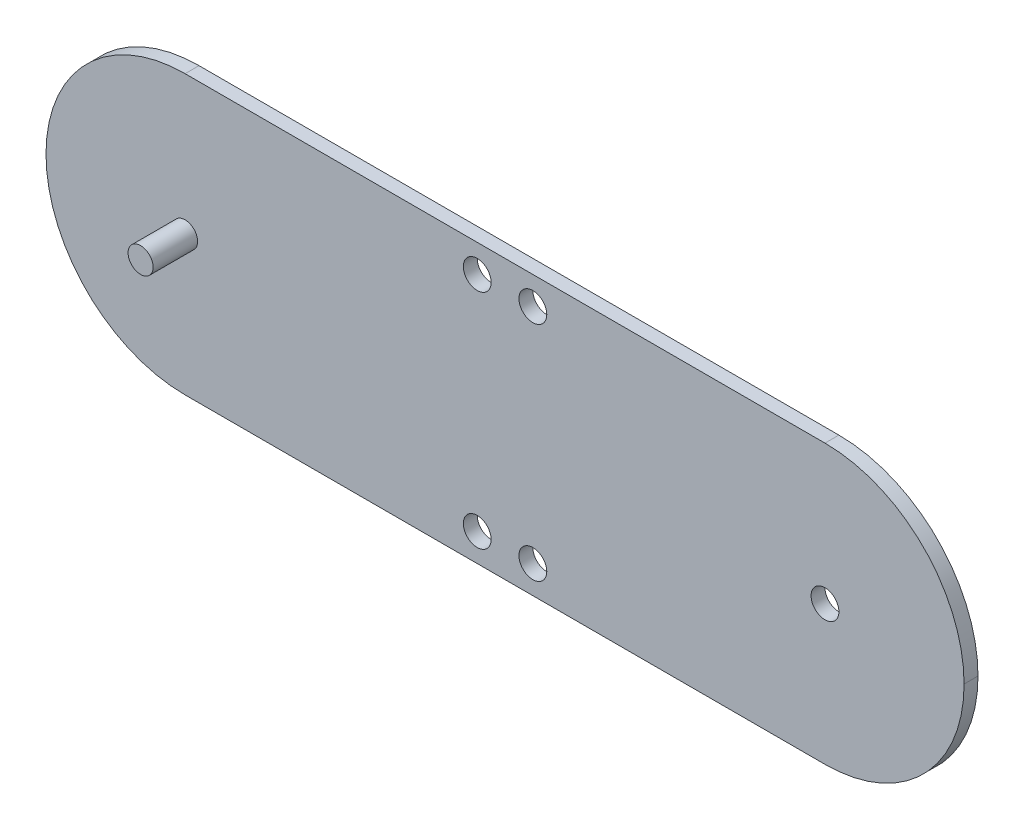
ISO-10303-21;
HEADER;
FILE_DESCRIPTION(('STEP AP214'),'2;1');
FILE_NAME('part.step','',(''),(''),'','','');
FILE_SCHEMA(('AUTOMOTIVE_DESIGN { 1 0 10303 214 1 1 1 1 }'));
ENDSEC;
DATA;
#1=APPLICATION_CONTEXT('core data for automotive mechanical design processes');
#2=APPLICATION_PROTOCOL_DEFINITION('international standard','automotive_design',2000,#1);
#3=PRODUCT_CONTEXT('',#1,'mechanical');
#4=PRODUCT('Part','Part','',(#3));
#5=PRODUCT_RELATED_PRODUCT_CATEGORY('part','',(#4));
#6=PRODUCT_DEFINITION_FORMATION('','',#4);
#7=PRODUCT_DEFINITION_CONTEXT('part definition',#1,'design');
#8=PRODUCT_DEFINITION('design','',#6,#7);
#9=PRODUCT_DEFINITION_SHAPE('','',#8);
#10=(LENGTH_UNIT() NAMED_UNIT(*) SI_UNIT(.MILLI.,.METRE.));
#11=(NAMED_UNIT(*) PLANE_ANGLE_UNIT() SI_UNIT($,.RADIAN.));
#12=(NAMED_UNIT(*) SI_UNIT($,.STERADIAN.) SOLID_ANGLE_UNIT());
#13=UNCERTAINTY_MEASURE_WITH_UNIT(LENGTH_MEASURE(1.E-05),#10,'distance_accuracy_value','');
#14=(GEOMETRIC_REPRESENTATION_CONTEXT(3) GLOBAL_UNCERTAINTY_ASSIGNED_CONTEXT((#13)) GLOBAL_UNIT_ASSIGNED_CONTEXT((#10,
#11,#12)) REPRESENTATION_CONTEXT('',''));
#15=CARTESIAN_POINT('',(0.,0.,0.));
#16=DIRECTION('',(0.,0.,1.));
#17=DIRECTION('',(1.,0.,0.));
#18=AXIS2_PLACEMENT_3D('',#15,#16,#17);
#19=CARTESIAN_POINT('',(82.5,-25.,2.5));
#20=DIRECTION('',(0.,1.,0.));
#21=DIRECTION('',(-1.,0.,0.));
#22=AXIS2_PLACEMENT_3D('',#19,#20,#21);
#23=PLANE('',#22);
#24=DIRECTION('',(1.,0.,0.));
#25=VECTOR('',#24,1.);
#26=CARTESIAN_POINT('',(82.5,-25.,2.5));
#27=LINE('',#26,#25);
#28=CARTESIAN_POINT('',(-57.5,-25.,2.5));
#29=VERTEX_POINT('',#28);
#30=CARTESIAN_POINT('',(57.5,-25.,2.5));
#31=VERTEX_POINT('',#30);
#32=EDGE_CURVE('E117',#29,#31,#27,.T.);
#33=ORIENTED_EDGE('',*,*,#32,.F.);
#34=DIRECTION('',(0.,0.,-1.));
#35=VECTOR('',#34,1.);
#36=CARTESIAN_POINT('',(-57.5,-25.,2.5));
#37=LINE('',#36,#35);
#38=CARTESIAN_POINT('',(-57.5,-25.,0.));
#39=VERTEX_POINT('',#38);
#40=EDGE_CURVE('E101',#29,#39,#37,.T.);
#41=ORIENTED_EDGE('',*,*,#40,.T.);
#42=DIRECTION('',(1.,0.,0.));
#43=VECTOR('',#42,1.);
#44=CARTESIAN_POINT('',(82.5,-25.,0.));
#45=LINE('',#44,#43);
#46=CARTESIAN_POINT('',(57.5,-25.,0.));
#47=VERTEX_POINT('',#46);
#48=EDGE_CURVE('E114',#39,#47,#45,.T.);
#49=ORIENTED_EDGE('',*,*,#48,.T.);
#50=DIRECTION('',(0.,0.,-1.));
#51=VECTOR('',#50,1.);
#52=CARTESIAN_POINT('',(57.5,-25.,2.5));
#53=LINE('',#52,#51);
#54=EDGE_CURVE('E120',#47,#31,#53,.F.);
#55=ORIENTED_EDGE('',*,*,#54,.T.);
#56=EDGE_LOOP('',(#33,#41,#49,#55));
#57=FACE_BOUND('',#56,.T.);
#58=ADVANCED_FACE('F43',(#57),#23,.F.);
#59=CARTESIAN_POINT('',(82.5,25.,2.5));
#60=DIRECTION('',(0.,-1.,0.));
#61=DIRECTION('',(1.,0.,0.));
#62=AXIS2_PLACEMENT_3D('',#59,#60,#61);
#63=PLANE('',#62);
#64=DIRECTION('',(-1.,0.,0.));
#65=VECTOR('',#64,1.);
#66=CARTESIAN_POINT('',(82.5,25.,0.));
#67=LINE('',#66,#65);
#68=CARTESIAN_POINT('',(57.5,25.,0.));
#69=VERTEX_POINT('',#68);
#70=CARTESIAN_POINT('',(-57.5,25.,0.));
#71=VERTEX_POINT('',#70);
#72=EDGE_CURVE('E126',#69,#71,#67,.T.);
#73=ORIENTED_EDGE('',*,*,#72,.T.);
#74=DIRECTION('',(0.,0.,-1.));
#75=VECTOR('',#74,1.);
#76=CARTESIAN_POINT('',(-57.5,25.,2.5));
#77=LINE('',#76,#75);
#78=CARTESIAN_POINT('',(-57.5,25.,2.5));
#79=VERTEX_POINT('',#78);
#80=EDGE_CURVE('E52',#71,#79,#77,.F.);
#81=ORIENTED_EDGE('',*,*,#80,.T.);
#82=DIRECTION('',(-1.,0.,0.));
#83=VECTOR('',#82,1.);
#84=CARTESIAN_POINT('',(82.5,25.,2.5));
#85=LINE('',#84,#83);
#86=CARTESIAN_POINT('',(57.5,25.,2.5));
#87=VERTEX_POINT('',#86);
#88=EDGE_CURVE('E134',#87,#79,#85,.T.);
#89=ORIENTED_EDGE('',*,*,#88,.F.);
#90=DIRECTION('',(0.,0.,-1.));
#91=VECTOR('',#90,1.);
#92=CARTESIAN_POINT('',(57.5,25.,2.5));
#93=LINE('',#92,#91);
#94=EDGE_CURVE('E156',#87,#69,#93,.T.);
#95=ORIENTED_EDGE('',*,*,#94,.T.);
#96=EDGE_LOOP('',(#73,#81,#89,#95));
#97=FACE_BOUND('',#96,.T.);
#98=ADVANCED_FACE('F195',(#97),#63,.F.);
#99=CARTESIAN_POINT('',(0.,0.,2.5));
#100=DIRECTION('',(0.,0.,-1.));
#101=DIRECTION('',(-1.,0.,0.));
#102=AXIS2_PLACEMENT_3D('',#99,#100,#101);
#103=PLANE('',#102);
#104=CARTESIAN_POINT('',(-57.5,0.,2.5));
#105=DIRECTION('',(0.,0.,-1.));
#106=DIRECTION('',(-1.,0.,0.));
#107=AXIS2_PLACEMENT_3D('',#104,#105,#106);
#108=CIRCLE('',#107,2.25);
#109=CARTESIAN_POINT('',(-59.75,0.,2.5));
#110=VERTEX_POINT('',#109);
#111=EDGE_CURVE('E12',#110,#110,#108,.F.);
#112=ORIENTED_EDGE('',*,*,#111,.F.);
#113=EDGE_LOOP('',(#112));
#114=FACE_BOUND('',#113,.T.);
#115=CARTESIAN_POINT('',(57.5,0.,2.5));
#116=DIRECTION('',(0.,0.,-1.));
#117=DIRECTION('',(-1.,0.,0.));
#118=AXIS2_PLACEMENT_3D('',#115,#116,#117);
#119=CIRCLE('',#118,2.5);
#120=CARTESIAN_POINT('',(55.,0.,2.5));
#121=VERTEX_POINT('',#120);
#122=EDGE_CURVE('E262',#121,#121,#119,.T.);
#123=ORIENTED_EDGE('',*,*,#122,.T.);
#124=EDGE_LOOP('',(#123));
#125=FACE_BOUND('',#124,.T.);
#126=CARTESIAN_POINT('',(-5.,-20.,2.5));
#127=DIRECTION('',(0.,0.,-1.));
#128=DIRECTION('',(1.,0.,0.));
#129=AXIS2_PLACEMENT_3D('',#126,#127,#128);
#130=CIRCLE('',#129,2.5);
#131=CARTESIAN_POINT('',(-2.5,-20.,2.5));
#132=VERTEX_POINT('',#131);
#133=EDGE_CURVE('E271',#132,#132,#130,.T.);
#134=ORIENTED_EDGE('',*,*,#133,.T.);
#135=EDGE_LOOP('',(#134));
#136=FACE_BOUND('',#135,.T.);
#137=CARTESIAN_POINT('',(5.,-20.,2.5));
#138=DIRECTION('',(0.,0.,-1.));
#139=DIRECTION('',(1.,0.,0.));
#140=AXIS2_PLACEMENT_3D('',#137,#138,#139);
#141=CIRCLE('',#140,2.5);
#142=CARTESIAN_POINT('',(7.5,-20.,2.5));
#143=VERTEX_POINT('',#142);
#144=EDGE_CURVE('E176',#143,#143,#141,.T.);
#145=ORIENTED_EDGE('',*,*,#144,.T.);
#146=EDGE_LOOP('',(#145));
#147=FACE_BOUND('',#146,.T.);
#148=CARTESIAN_POINT('',(-5.,20.,2.5));
#149=DIRECTION('',(0.,0.,1.));
#150=DIRECTION('',(1.,0.,0.));
#151=AXIS2_PLACEMENT_3D('',#148,#149,#150);
#152=CIRCLE('',#151,2.5);
#153=CARTESIAN_POINT('',(-2.5,20.,2.5));
#154=VERTEX_POINT('',#153);
#155=EDGE_CURVE('E167',#154,#154,#152,.T.);
#156=ORIENTED_EDGE('',*,*,#155,.F.);
#157=EDGE_LOOP('',(#156));
#158=FACE_BOUND('',#157,.T.);
#159=CARTESIAN_POINT('',(5.,20.,2.5));
#160=DIRECTION('',(0.,0.,1.));
#161=DIRECTION('',(1.,0.,0.));
#162=AXIS2_PLACEMENT_3D('',#159,#160,#161);
#163=CIRCLE('',#162,2.5);
#164=CARTESIAN_POINT('',(7.5,20.,2.5));
#165=VERTEX_POINT('',#164);
#166=EDGE_CURVE('E182',#165,#165,#163,.T.);
#167=ORIENTED_EDGE('',*,*,#166,.F.);
#168=EDGE_LOOP('',(#167));
#169=FACE_BOUND('',#168,.T.);
#170=CARTESIAN_POINT('',(-57.5,0.,2.5));
#171=DIRECTION('',(0.,0.,-1.));
#172=DIRECTION('',(-1.,0.,0.));
#173=AXIS2_PLACEMENT_3D('',#170,#171,#172);
#174=CIRCLE('',#173,25.);
#175=CARTESIAN_POINT('',(-82.5,0.,2.5));
#176=VERTEX_POINT('',#175);
#177=EDGE_CURVE('E150',#79,#176,#174,.F.);
#178=ORIENTED_EDGE('',*,*,#177,.T.);
#179=CARTESIAN_POINT('',(-57.5,0.,2.5));
#180=DIRECTION('',(0.,0.,-1.));
#181=DIRECTION('',(-1.,0.,0.));
#182=AXIS2_PLACEMENT_3D('',#179,#180,#181);
#183=CIRCLE('',#182,25.);
#184=EDGE_CURVE('E153',#176,#29,#183,.F.);
#185=ORIENTED_EDGE('',*,*,#184,.T.);
#186=ORIENTED_EDGE('',*,*,#32,.T.);
#187=CARTESIAN_POINT('',(57.5,0.,2.5));
#188=DIRECTION('',(0.,0.,-1.));
#189=DIRECTION('',(-1.,0.,0.));
#190=AXIS2_PLACEMENT_3D('',#187,#188,#189);
#191=CIRCLE('',#190,25.);
#192=CARTESIAN_POINT('',(82.5,0.,2.5));
#193=VERTEX_POINT('',#192);
#194=EDGE_CURVE('E147',#31,#193,#191,.F.);
#195=ORIENTED_EDGE('',*,*,#194,.T.);
#196=CARTESIAN_POINT('',(57.5,0.,2.5));
#197=DIRECTION('',(0.,0.,-1.));
#198=DIRECTION('',(-1.,0.,0.));
#199=AXIS2_PLACEMENT_3D('',#196,#197,#198);
#200=CIRCLE('',#199,25.);
#201=EDGE_CURVE('E65',#193,#87,#200,.F.);
#202=ORIENTED_EDGE('',*,*,#201,.T.);
#203=ORIENTED_EDGE('',*,*,#88,.T.);
#204=EDGE_LOOP('',(#178,#185,#186,#195,#202,#203));
#205=FACE_BOUND('',#204,.T.);
#206=ADVANCED_FACE('F189',(#114,#125,#136,#147,#158,#169,#205),#103,.F.);
#207=CARTESIAN_POINT('',(0.,0.,0.));
#208=DIRECTION('',(0.,0.,-1.));
#209=DIRECTION('',(-1.,0.,0.));
#210=AXIS2_PLACEMENT_3D('',#207,#208,#209);
#211=PLANE('',#210);
#212=CARTESIAN_POINT('',(57.5,0.,0.));
#213=DIRECTION('',(0.,0.,-1.));
#214=DIRECTION('',(-1.,0.,0.));
#215=AXIS2_PLACEMENT_3D('',#212,#213,#214);
#216=CIRCLE('',#215,2.5);
#217=CARTESIAN_POINT('',(55.,0.,0.));
#218=VERTEX_POINT('',#217);
#219=EDGE_CURVE('E258',#218,#218,#216,.T.);
#220=ORIENTED_EDGE('',*,*,#219,.F.);
#221=EDGE_LOOP('',(#220));
#222=FACE_BOUND('',#221,.T.);
#223=CARTESIAN_POINT('',(-5.,-20.,0.));
#224=DIRECTION('',(0.,0.,-1.));
#225=DIRECTION('',(1.,0.,0.));
#226=AXIS2_PLACEMENT_3D('',#223,#224,#225);
#227=CIRCLE('',#226,2.5);
#228=CARTESIAN_POINT('',(-2.5,-20.,0.));
#229=VERTEX_POINT('',#228);
#230=EDGE_CURVE('E185',#229,#229,#227,.T.);
#231=ORIENTED_EDGE('',*,*,#230,.F.);
#232=EDGE_LOOP('',(#231));
#233=FACE_BOUND('',#232,.T.);
#234=CARTESIAN_POINT('',(5.,-20.,0.));
#235=DIRECTION('',(0.,0.,-1.));
#236=DIRECTION('',(1.,0.,0.));
#237=AXIS2_PLACEMENT_3D('',#234,#235,#236);
#238=CIRCLE('',#237,2.5);
#239=CARTESIAN_POINT('',(7.5,-20.,0.));
#240=VERTEX_POINT('',#239);
#241=EDGE_CURVE('E274',#240,#240,#238,.T.);
#242=ORIENTED_EDGE('',*,*,#241,.F.);
#243=EDGE_LOOP('',(#242));
#244=FACE_BOUND('',#243,.T.);
#245=CARTESIAN_POINT('',(-5.,20.,0.));
#246=DIRECTION('',(0.,0.,1.));
#247=DIRECTION('',(1.,0.,0.));
#248=AXIS2_PLACEMENT_3D('',#245,#246,#247);
#249=CIRCLE('',#248,2.5);
#250=CARTESIAN_POINT('',(-2.5,20.,0.));
#251=VERTEX_POINT('',#250);
#252=EDGE_CURVE('E162',#251,#251,#249,.T.);
#253=ORIENTED_EDGE('',*,*,#252,.T.);
#254=EDGE_LOOP('',(#253));
#255=FACE_BOUND('',#254,.T.);
#256=CARTESIAN_POINT('',(5.,20.,0.));
#257=DIRECTION('',(0.,0.,1.));
#258=DIRECTION('',(1.,0.,0.));
#259=AXIS2_PLACEMENT_3D('',#256,#257,#258);
#260=CIRCLE('',#259,2.5);
#261=CARTESIAN_POINT('',(7.5,20.,0.));
#262=VERTEX_POINT('',#261);
#263=EDGE_CURVE('E173',#262,#262,#260,.T.);
#264=ORIENTED_EDGE('',*,*,#263,.T.);
#265=EDGE_LOOP('',(#264));
#266=FACE_BOUND('',#265,.T.);
#267=ORIENTED_EDGE('',*,*,#48,.F.);
#268=CARTESIAN_POINT('',(-57.5,0.,0.));
#269=DIRECTION('',(0.,0.,-1.));
#270=DIRECTION('',(-1.,0.,0.));
#271=AXIS2_PLACEMENT_3D('',#268,#269,#270);
#272=CIRCLE('',#271,25.);
#273=CARTESIAN_POINT('',(-82.5,0.,0.));
#274=VERTEX_POINT('',#273);
#275=EDGE_CURVE('E97',#39,#274,#272,.T.);
#276=ORIENTED_EDGE('',*,*,#275,.T.);
#277=CARTESIAN_POINT('',(-57.5,0.,0.));
#278=DIRECTION('',(0.,0.,-1.));
#279=DIRECTION('',(-1.,0.,0.));
#280=AXIS2_PLACEMENT_3D('',#277,#278,#279);
#281=CIRCLE('',#280,25.);
#282=EDGE_CURVE('E108',#274,#71,#281,.T.);
#283=ORIENTED_EDGE('',*,*,#282,.T.);
#284=ORIENTED_EDGE('',*,*,#72,.F.);
#285=CARTESIAN_POINT('',(57.5,0.,0.));
#286=DIRECTION('',(0.,0.,-1.));
#287=DIRECTION('',(-1.,0.,0.));
#288=AXIS2_PLACEMENT_3D('',#285,#286,#287);
#289=CIRCLE('',#288,25.);
#290=CARTESIAN_POINT('',(82.5,0.,0.));
#291=VERTEX_POINT('',#290);
#292=EDGE_CURVE('E119',#69,#291,#289,.T.);
#293=ORIENTED_EDGE('',*,*,#292,.T.);
#294=CARTESIAN_POINT('',(57.5,0.,0.));
#295=DIRECTION('',(0.,0.,-1.));
#296=DIRECTION('',(-1.,0.,0.));
#297=AXIS2_PLACEMENT_3D('',#294,#295,#296);
#298=CIRCLE('',#297,25.);
#299=EDGE_CURVE('E124',#291,#47,#298,.T.);
#300=ORIENTED_EDGE('',*,*,#299,.T.);
#301=EDGE_LOOP('',(#267,#276,#283,#284,#293,#300));
#302=FACE_BOUND('',#301,.T.);
#303=ADVANCED_FACE('F122',(#222,#233,#244,#255,#266,#302),#211,.T.);
#304=CARTESIAN_POINT('',(-57.5,0.,2.5));
#305=DIRECTION('',(0.,0.,-1.));
#306=DIRECTION('',(-1.,0.,0.));
#307=AXIS2_PLACEMENT_3D('',#304,#305,#306);
#308=CYLINDRICAL_SURFACE('',#307,25.);
#309=DIRECTION('',(0.,0.,-1.));
#310=VECTOR('',#309,1.);
#311=CARTESIAN_POINT('',(-82.5,0.,2.5));
#312=LINE('',#311,#310);
#313=EDGE_CURVE('E103',#176,#274,#312,.T.);
#314=ORIENTED_EDGE('',*,*,#313,.F.);
#315=ORIENTED_EDGE('',*,*,#177,.F.);
#316=ORIENTED_EDGE('',*,*,#80,.F.);
#317=ORIENTED_EDGE('',*,*,#282,.F.);
#318=EDGE_LOOP('',(#314,#315,#316,#317));
#319=FACE_BOUND('',#318,.T.);
#320=ADVANCED_FACE('F192',(#319),#308,.T.);
#321=CARTESIAN_POINT('',(-57.5,0.,2.5));
#322=DIRECTION('',(0.,0.,-1.));
#323=DIRECTION('',(-1.,0.,0.));
#324=AXIS2_PLACEMENT_3D('',#321,#322,#323);
#325=CYLINDRICAL_SURFACE('',#324,25.);
#326=ORIENTED_EDGE('',*,*,#184,.F.);
#327=ORIENTED_EDGE('',*,*,#313,.T.);
#328=ORIENTED_EDGE('',*,*,#275,.F.);
#329=ORIENTED_EDGE('',*,*,#40,.F.);
#330=EDGE_LOOP('',(#326,#327,#328,#329));
#331=FACE_BOUND('',#330,.T.);
#332=ADVANCED_FACE('F100',(#331),#325,.T.);
#333=CARTESIAN_POINT('',(57.5,0.,2.5));
#334=DIRECTION('',(0.,0.,-1.));
#335=DIRECTION('',(-1.,0.,0.));
#336=AXIS2_PLACEMENT_3D('',#333,#334,#335);
#337=CYLINDRICAL_SURFACE('',#336,25.);
#338=ORIENTED_EDGE('',*,*,#94,.F.);
#339=ORIENTED_EDGE('',*,*,#201,.F.);
#340=DIRECTION('',(0.,0.,-1.));
#341=VECTOR('',#340,1.);
#342=CARTESIAN_POINT('',(82.5,0.,2.5));
#343=LINE('',#342,#341);
#344=EDGE_CURVE('E131',#291,#193,#343,.F.);
#345=ORIENTED_EDGE('',*,*,#344,.F.);
#346=ORIENTED_EDGE('',*,*,#292,.F.);
#347=EDGE_LOOP('',(#338,#339,#345,#346));
#348=FACE_BOUND('',#347,.T.);
#349=ADVANCED_FACE('F45',(#348),#337,.T.);
#350=CARTESIAN_POINT('',(57.5,0.,2.5));
#351=DIRECTION('',(0.,0.,-1.));
#352=DIRECTION('',(-1.,0.,0.));
#353=AXIS2_PLACEMENT_3D('',#350,#351,#352);
#354=CYLINDRICAL_SURFACE('',#353,25.);
#355=ORIENTED_EDGE('',*,*,#194,.F.);
#356=ORIENTED_EDGE('',*,*,#54,.F.);
#357=ORIENTED_EDGE('',*,*,#299,.F.);
#358=ORIENTED_EDGE('',*,*,#344,.T.);
#359=EDGE_LOOP('',(#355,#356,#357,#358));
#360=FACE_BOUND('',#359,.T.);
#361=ADVANCED_FACE('F197',(#360),#354,.T.);
#362=CARTESIAN_POINT('',(5.,20.,0.));
#363=DIRECTION('',(0.,0.,1.));
#364=DIRECTION('',(1.,0.,0.));
#365=AXIS2_PLACEMENT_3D('',#362,#363,#364);
#366=CYLINDRICAL_SURFACE('',#365,2.5);
#367=ORIENTED_EDGE('',*,*,#263,.F.);
#368=EDGE_LOOP('',(#367));
#369=FACE_BOUND('',#368,.T.);
#370=ORIENTED_EDGE('',*,*,#166,.T.);
#371=EDGE_LOOP('',(#370));
#372=FACE_BOUND('',#371,.T.);
#373=ADVANCED_FACE('F199',(#369,#372),#366,.F.);
#374=CARTESIAN_POINT('',(-5.,20.,0.));
#375=DIRECTION('',(0.,0.,1.));
#376=DIRECTION('',(1.,0.,0.));
#377=AXIS2_PLACEMENT_3D('',#374,#375,#376);
#378=CYLINDRICAL_SURFACE('',#377,2.5);
#379=ORIENTED_EDGE('',*,*,#252,.F.);
#380=EDGE_LOOP('',(#379));
#381=FACE_BOUND('',#380,.T.);
#382=ORIENTED_EDGE('',*,*,#155,.T.);
#383=EDGE_LOOP('',(#382));
#384=FACE_BOUND('',#383,.T.);
#385=ADVANCED_FACE('F204',(#381,#384),#378,.F.);
#386=CARTESIAN_POINT('',(5.,-20.,0.));
#387=DIRECTION('',(0.,0.,1.));
#388=DIRECTION('',(1.,0.,0.));
#389=AXIS2_PLACEMENT_3D('',#386,#387,#388);
#390=CYLINDRICAL_SURFACE('',#389,2.5);
#391=ORIENTED_EDGE('',*,*,#241,.T.);
#392=EDGE_LOOP('',(#391));
#393=FACE_BOUND('',#392,.T.);
#394=ORIENTED_EDGE('',*,*,#144,.F.);
#395=EDGE_LOOP('',(#394));
#396=FACE_BOUND('',#395,.T.);
#397=ADVANCED_FACE('F232',(#393,#396),#390,.F.);
#398=CARTESIAN_POINT('',(-5.,-20.,0.));
#399=DIRECTION('',(0.,0.,1.));
#400=DIRECTION('',(1.,0.,0.));
#401=AXIS2_PLACEMENT_3D('',#398,#399,#400);
#402=CYLINDRICAL_SURFACE('',#401,2.5);
#403=ORIENTED_EDGE('',*,*,#230,.T.);
#404=EDGE_LOOP('',(#403));
#405=FACE_BOUND('',#404,.T.);
#406=ORIENTED_EDGE('',*,*,#133,.F.);
#407=EDGE_LOOP('',(#406));
#408=FACE_BOUND('',#407,.T.);
#409=ADVANCED_FACE('F236',(#405,#408),#402,.F.);
#410=CARTESIAN_POINT('',(57.5,0.,2.5));
#411=DIRECTION('',(0.,0.,-1.));
#412=DIRECTION('',(-1.,0.,0.));
#413=AXIS2_PLACEMENT_3D('',#410,#411,#412);
#414=CYLINDRICAL_SURFACE('',#413,2.5);
#415=ORIENTED_EDGE('',*,*,#122,.F.);
#416=EDGE_LOOP('',(#415));
#417=FACE_BOUND('',#416,.T.);
#418=ORIENTED_EDGE('',*,*,#219,.T.);
#419=EDGE_LOOP('',(#418));
#420=FACE_BOUND('',#419,.T.);
#421=ADVANCED_FACE('F240',(#417,#420),#414,.F.);
#422=CARTESIAN_POINT('',(-57.5,0.,10.5));
#423=DIRECTION('',(0.,0.,-1.));
#424=DIRECTION('',(-1.,0.,0.));
#425=AXIS2_PLACEMENT_3D('',#422,#423,#424);
#426=CYLINDRICAL_SURFACE('',#425,2.25);
#427=CARTESIAN_POINT('',(-57.5,0.,10.5));
#428=DIRECTION('',(0.,0.,1.));
#429=DIRECTION('',(1.,0.,0.));
#430=AXIS2_PLACEMENT_3D('',#427,#428,#429);
#431=CIRCLE('',#430,2.25);
#432=CARTESIAN_POINT('',(-55.25,0.,10.5));
#433=VERTEX_POINT('',#432);
#434=EDGE_CURVE('E256',#433,#433,#431,.T.);
#435=ORIENTED_EDGE('',*,*,#434,.F.);
#436=EDGE_LOOP('',(#435));
#437=FACE_BOUND('',#436,.T.);
#438=ORIENTED_EDGE('',*,*,#111,.T.);
#439=EDGE_LOOP('',(#438));
#440=FACE_BOUND('',#439,.T.);
#441=ADVANCED_FACE('F244',(#437,#440),#426,.T.);
#442=CARTESIAN_POINT('',(0.,0.,10.5));
#443=DIRECTION('',(0.,0.,1.));
#444=DIRECTION('',(1.,0.,0.));
#445=AXIS2_PLACEMENT_3D('',#442,#443,#444);
#446=PLANE('',#445);
#447=ORIENTED_EDGE('',*,*,#434,.T.);
#448=EDGE_LOOP('',(#447));
#449=FACE_BOUND('',#448,.T.);
#450=ADVANCED_FACE('F248',(#449),#446,.T.);
#451=CLOSED_SHELL('',(#58,#98,#206,#303,#320,#332,#349,#361,#373,#385,#397,#409,#421,#441,#450));
#452=MANIFOLD_SOLID_BREP('B2',#451);
#453=ADVANCED_BREP_SHAPE_REPRESENTATION('',(#18,#452),#14);
#454=SHAPE_DEFINITION_REPRESENTATION(#9,#453);
ENDSEC;
END-ISO-10303-21;
